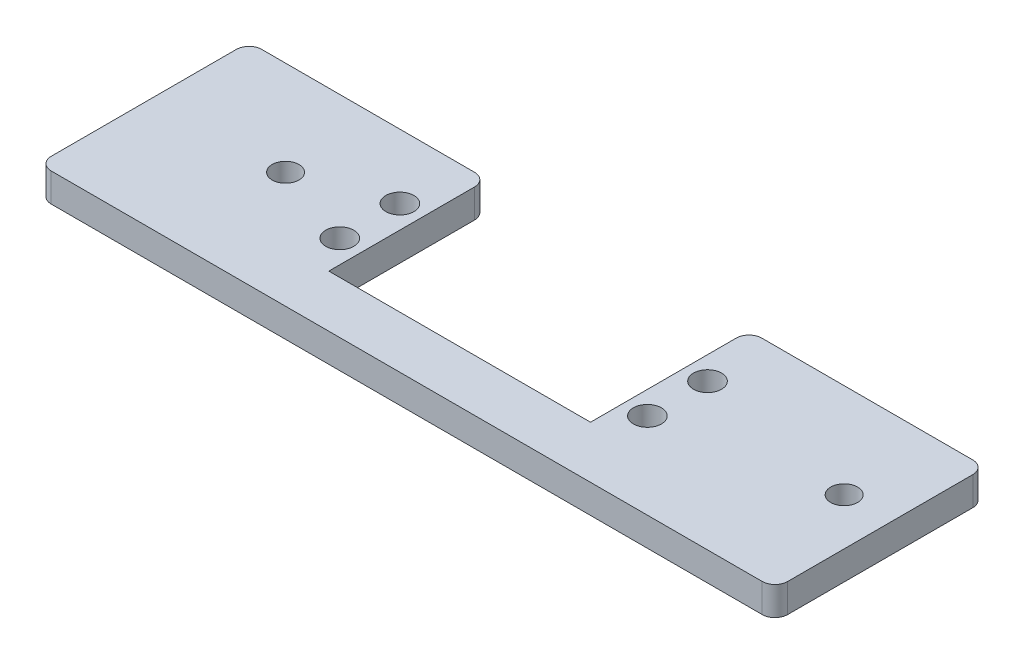
ISO-10303-21;
HEADER;
FILE_DESCRIPTION(('STEP AP214'),'2;1');
FILE_NAME('part.step','',(''),(''),'','','');
FILE_SCHEMA(('AUTOMOTIVE_DESIGN { 1 0 10303 214 1 1 1 1 }'));
ENDSEC;
DATA;
#1=APPLICATION_CONTEXT('core data for automotive mechanical design processes');
#2=APPLICATION_PROTOCOL_DEFINITION('international standard','automotive_design',2000,#1);
#3=PRODUCT_CONTEXT('',#1,'mechanical');
#4=PRODUCT('Part','Part','',(#3));
#5=PRODUCT_RELATED_PRODUCT_CATEGORY('part','',(#4));
#6=PRODUCT_DEFINITION_FORMATION('','',#4);
#7=PRODUCT_DEFINITION_CONTEXT('part definition',#1,'design');
#8=PRODUCT_DEFINITION('design','',#6,#7);
#9=PRODUCT_DEFINITION_SHAPE('','',#8);
#10=(LENGTH_UNIT() NAMED_UNIT(*) SI_UNIT(.MILLI.,.METRE.));
#11=(NAMED_UNIT(*) PLANE_ANGLE_UNIT() SI_UNIT($,.RADIAN.));
#12=(NAMED_UNIT(*) SI_UNIT($,.STERADIAN.) SOLID_ANGLE_UNIT());
#13=UNCERTAINTY_MEASURE_WITH_UNIT(LENGTH_MEASURE(1.E-05),#10,'distance_accuracy_value','');
#14=(GEOMETRIC_REPRESENTATION_CONTEXT(3) GLOBAL_UNCERTAINTY_ASSIGNED_CONTEXT((#13)) GLOBAL_UNIT_ASSIGNED_CONTEXT((#10,
#11,#12)) REPRESENTATION_CONTEXT('',''));
#15=CARTESIAN_POINT('',(0.,0.,0.));
#16=DIRECTION('',(0.,0.,1.));
#17=DIRECTION('',(1.,0.,0.));
#18=AXIS2_PLACEMENT_3D('',#15,#16,#17);
#19=CARTESIAN_POINT('',(22.65807516,4.5,-14.51));
#20=DIRECTION('',(0.,-1.,0.));
#21=DIRECTION('',(0.,0.,-1.));
#22=AXIS2_PLACEMENT_3D('',#19,#20,#21);
#23=PLANE('',#22);
#24=CARTESIAN_POINT('',(24.258075072,4.5,3.025000078));
#25=DIRECTION('',(0.,1.,0.));
#26=DIRECTION('',(0.,0.,1.));
#27=AXIS2_PLACEMENT_3D('',#24,#25,#26);
#28=CIRCLE('',#27,2.2);
#29=CARTESIAN_POINT('',(24.258075072,4.5,5.225000078));
#30=VERTEX_POINT('',#29);
#31=EDGE_CURVE('E326',#30,#30,#28,.T.);
#32=ORIENTED_EDGE('',*,*,#31,.F.);
#33=EDGE_LOOP('',(#32));
#34=FACE_BOUND('',#33,.T.);
#35=CARTESIAN_POINT('',(-23.988324752,4.5,-6.404999922));
#36=DIRECTION('',(0.,1.,0.));
#37=DIRECTION('',(0.,0.,1.));
#38=AXIS2_PLACEMENT_3D('',#35,#36,#37);
#39=CIRCLE('',#38,2.2);
#40=CARTESIAN_POINT('',(-23.988324752,4.5,-4.204999922));
#41=VERTEX_POINT('',#40);
#42=EDGE_CURVE('E338',#41,#41,#39,.T.);
#43=ORIENTED_EDGE('',*,*,#42,.F.);
#44=EDGE_LOOP('',(#43));
#45=FACE_BOUND('',#44,.T.);
#46=CARTESIAN_POINT('',(-37.20312484,4.5,-1.689999922));
#47=DIRECTION('',(0.,1.,0.));
#48=DIRECTION('',(0.,0.,1.));
#49=AXIS2_PLACEMENT_3D('',#46,#47,#48);
#50=CIRCLE('',#49,2.1082);
#51=CARTESIAN_POINT('',(-37.20312484,4.5,0.418200078000001));
#52=VERTEX_POINT('',#51);
#53=EDGE_CURVE('E170',#52,#52,#50,.T.);
#54=ORIENTED_EDGE('',*,*,#53,.F.);
#55=EDGE_LOOP('',(#54));
#56=FACE_BOUND('',#55,.T.);
#57=DIRECTION('',(-1.,0.,0.));
#58=VECTOR('',#57,1.);
#59=CARTESIAN_POINT('',(-20.38832484,4.5,8.345000078));
#60=LINE('',#59,#58);
#61=CARTESIAN_POINT('',(20.65807516,4.5,8.345000078));
#62=VERTEX_POINT('',#61);
#63=CARTESIAN_POINT('',(-20.38832484,4.5,8.345000078));
#64=VERTEX_POINT('',#63);
#65=EDGE_CURVE('E193',#62,#64,#60,.T.);
#66=ORIENTED_EDGE('',*,*,#65,.T.);
#67=DIRECTION('',(0.,0.,-1.));
#68=VECTOR('',#67,1.);
#69=CARTESIAN_POINT('',(-20.38832484,4.5,-14.51));
#70=LINE('',#69,#68);
#71=CARTESIAN_POINT('',(-20.38832484,4.5,-14.51));
#72=VERTEX_POINT('',#71);
#73=EDGE_CURVE('E111',#64,#72,#70,.T.);
#74=ORIENTED_EDGE('',*,*,#73,.T.);
#75=CARTESIAN_POINT('',(-22.38832484,4.5,-14.51));
#76=DIRECTION('',(0.,1.,0.));
#77=DIRECTION('',(0.,0.,1.));
#78=AXIS2_PLACEMENT_3D('',#75,#76,#77);
#79=CIRCLE('',#78,2.);
#80=CARTESIAN_POINT('',(-22.38832484,4.5,-16.51));
#81=VERTEX_POINT('',#80);
#82=EDGE_CURVE('E226',#72,#81,#79,.T.);
#83=ORIENTED_EDGE('',*,*,#82,.T.);
#84=DIRECTION('',(-1.,0.,0.));
#85=VECTOR('',#84,1.);
#86=CARTESIAN_POINT('',(-22.38832484,4.5,-16.51));
#87=LINE('',#86,#85);
#88=CARTESIAN_POINT('',(-55.75,4.5,-16.51));
#89=VERTEX_POINT('',#88);
#90=EDGE_CURVE('E245',#81,#89,#87,.T.);
#91=ORIENTED_EDGE('',*,*,#90,.T.);
#92=CARTESIAN_POINT('',(-55.75,4.5,-14.51));
#93=DIRECTION('',(0.,1.,0.));
#94=DIRECTION('',(0.,0.,1.));
#95=AXIS2_PLACEMENT_3D('',#92,#93,#94);
#96=CIRCLE('',#95,2.);
#97=CARTESIAN_POINT('',(-57.75,4.5,-14.51));
#98=VERTEX_POINT('',#97);
#99=EDGE_CURVE('E242',#89,#98,#96,.T.);
#100=ORIENTED_EDGE('',*,*,#99,.T.);
#101=DIRECTION('',(0.,0.,1.));
#102=VECTOR('',#101,1.);
#103=CARTESIAN_POINT('',(-57.75,4.5,-14.51));
#104=LINE('',#103,#102);
#105=CARTESIAN_POINT('',(-57.75,4.5,14.51));
#106=VERTEX_POINT('',#105);
#107=EDGE_CURVE('E244',#98,#106,#104,.T.);
#108=ORIENTED_EDGE('',*,*,#107,.T.);
#109=CARTESIAN_POINT('',(-55.75,4.5,14.51));
#110=DIRECTION('',(0.,1.,0.));
#111=DIRECTION('',(0.,0.,-1.));
#112=AXIS2_PLACEMENT_3D('',#109,#110,#111);
#113=CIRCLE('',#112,2.);
#114=CARTESIAN_POINT('',(-55.75,4.5,16.51));
#115=VERTEX_POINT('',#114);
#116=EDGE_CURVE('E247',#106,#115,#113,.T.);
#117=ORIENTED_EDGE('',*,*,#116,.T.);
#118=DIRECTION('',(1.,0.,0.));
#119=VECTOR('',#118,1.);
#120=CARTESIAN_POINT('',(55.75,4.5,16.51));
#121=LINE('',#120,#119);
#122=CARTESIAN_POINT('',(55.75,4.5,16.51));
#123=VERTEX_POINT('',#122);
#124=EDGE_CURVE('E253',#115,#123,#121,.T.);
#125=ORIENTED_EDGE('',*,*,#124,.T.);
#126=CARTESIAN_POINT('',(55.75,4.5,14.51));
#127=DIRECTION('',(0.,1.,0.));
#128=DIRECTION('',(0.,0.,-1.));
#129=AXIS2_PLACEMENT_3D('',#126,#127,#128);
#130=CIRCLE('',#129,2.);
#131=CARTESIAN_POINT('',(57.75,4.5,14.51));
#132=VERTEX_POINT('',#131);
#133=EDGE_CURVE('E255',#123,#132,#130,.T.);
#134=ORIENTED_EDGE('',*,*,#133,.T.);
#135=DIRECTION('',(0.,0.,-1.));
#136=VECTOR('',#135,1.);
#137=CARTESIAN_POINT('',(57.75,4.5,-14.51));
#138=LINE('',#137,#136);
#139=CARTESIAN_POINT('',(57.75,4.5,-14.51));
#140=VERTEX_POINT('',#139);
#141=EDGE_CURVE('E257',#132,#140,#138,.T.);
#142=ORIENTED_EDGE('',*,*,#141,.T.);
#143=CARTESIAN_POINT('',(55.75,4.5,-14.51));
#144=DIRECTION('',(0.,1.,0.));
#145=DIRECTION('',(0.,0.,-1.));
#146=AXIS2_PLACEMENT_3D('',#143,#144,#145);
#147=CIRCLE('',#146,2.);
#148=CARTESIAN_POINT('',(55.75,4.5,-16.51));
#149=VERTEX_POINT('',#148);
#150=EDGE_CURVE('E148',#140,#149,#147,.T.);
#151=ORIENTED_EDGE('',*,*,#150,.T.);
#152=DIRECTION('',(-1.,0.,0.));
#153=VECTOR('',#152,1.);
#154=CARTESIAN_POINT('',(55.75,4.5,-16.51));
#155=LINE('',#154,#153);
#156=CARTESIAN_POINT('',(22.65807516,4.5,-16.51));
#157=VERTEX_POINT('',#156);
#158=EDGE_CURVE('E142',#149,#157,#155,.T.);
#159=ORIENTED_EDGE('',*,*,#158,.T.);
#160=CARTESIAN_POINT('',(22.65807516,4.5,-14.51));
#161=DIRECTION('',(0.,1.,0.));
#162=DIRECTION('',(0.,0.,-1.));
#163=AXIS2_PLACEMENT_3D('',#160,#161,#162);
#164=CIRCLE('',#163,2.);
#165=CARTESIAN_POINT('',(20.65807516,4.5,-14.51));
#166=VERTEX_POINT('',#165);
#167=EDGE_CURVE('E146',#157,#166,#164,.T.);
#168=ORIENTED_EDGE('',*,*,#167,.T.);
#169=DIRECTION('',(0.,0.,1.));
#170=VECTOR('',#169,1.);
#171=CARTESIAN_POINT('',(20.65807516,4.5,-14.51));
#172=LINE('',#171,#170);
#173=EDGE_CURVE('E50',#166,#62,#172,.T.);
#174=ORIENTED_EDGE('',*,*,#173,.T.);
#175=EDGE_LOOP('',(#66,#74,#83,#91,#100,#108,#117,#125,#134,#142,#151,#159,#168,#174));
#176=FACE_BOUND('',#175,.T.);
#177=CARTESIAN_POINT('',(50.40147516,4.5,-1.68999992200002));
#178=DIRECTION('',(0.,1.,0.));
#179=DIRECTION('',(0.,0.,-1.));
#180=AXIS2_PLACEMENT_3D('',#177,#178,#179);
#181=CIRCLE('',#180,2.1082);
#182=CARTESIAN_POINT('',(50.40147516,4.5,-3.79819992200002));
#183=VERTEX_POINT('',#182);
#184=EDGE_CURVE('E344',#183,#183,#181,.T.);
#185=ORIENTED_EDGE('',*,*,#184,.F.);
#186=EDGE_LOOP('',(#185));
#187=FACE_BOUND('',#186,.T.);
#188=CARTESIAN_POINT('',(24.258075072,4.5,-6.404999922));
#189=DIRECTION('',(0.,1.,0.));
#190=DIRECTION('',(0.,0.,-1.));
#191=AXIS2_PLACEMENT_3D('',#188,#189,#190);
#192=CIRCLE('',#191,2.2);
#193=CARTESIAN_POINT('',(24.258075072,4.5,-8.604999922));
#194=VERTEX_POINT('',#193);
#195=EDGE_CURVE('E332',#194,#194,#192,.T.);
#196=ORIENTED_EDGE('',*,*,#195,.F.);
#197=EDGE_LOOP('',(#196));
#198=FACE_BOUND('',#197,.T.);
#199=CARTESIAN_POINT('',(-23.988324752,4.5,3.025000078));
#200=DIRECTION('',(0.,1.,0.));
#201=DIRECTION('',(0.,0.,-1.));
#202=AXIS2_PLACEMENT_3D('',#199,#200,#201);
#203=CIRCLE('',#202,2.2);
#204=CARTESIAN_POINT('',(-23.988324752,4.5,0.825000077999996));
#205=VERTEX_POINT('',#204);
#206=EDGE_CURVE('E317',#205,#205,#203,.T.);
#207=ORIENTED_EDGE('',*,*,#206,.F.);
#208=EDGE_LOOP('',(#207));
#209=FACE_BOUND('',#208,.T.);
#210=ADVANCED_FACE('F33',(#34,#45,#56,#176,#187,#198,#209),#23,.F.);
#211=CARTESIAN_POINT('',(22.65807516,0.,-14.51));
#212=DIRECTION('',(0.,-1.,0.));
#213=DIRECTION('',(0.,0.,-1.));
#214=AXIS2_PLACEMENT_3D('',#211,#212,#213);
#215=PLANE('',#214);
#216=CARTESIAN_POINT('',(24.258075072,0.,3.025000078));
#217=DIRECTION('',(0.,1.,0.));
#218=DIRECTION('',(0.,0.,1.));
#219=AXIS2_PLACEMENT_3D('',#216,#217,#218);
#220=CIRCLE('',#219,2.2);
#221=CARTESIAN_POINT('',(24.258075072,0.,5.225000078));
#222=VERTEX_POINT('',#221);
#223=EDGE_CURVE('E323',#222,#222,#220,.T.);
#224=ORIENTED_EDGE('',*,*,#223,.T.);
#225=EDGE_LOOP('',(#224));
#226=FACE_BOUND('',#225,.T.);
#227=CARTESIAN_POINT('',(-23.988324752,0.,-6.404999922));
#228=DIRECTION('',(0.,1.,0.));
#229=DIRECTION('',(0.,0.,1.));
#230=AXIS2_PLACEMENT_3D('',#227,#228,#229);
#231=CIRCLE('',#230,2.2);
#232=CARTESIAN_POINT('',(-23.988324752,0.,-4.204999922));
#233=VERTEX_POINT('',#232);
#234=EDGE_CURVE('E335',#233,#233,#231,.T.);
#235=ORIENTED_EDGE('',*,*,#234,.T.);
#236=EDGE_LOOP('',(#235));
#237=FACE_BOUND('',#236,.T.);
#238=CARTESIAN_POINT('',(-37.20312484,0.,-1.689999922));
#239=DIRECTION('',(0.,1.,0.));
#240=DIRECTION('',(0.,0.,1.));
#241=AXIS2_PLACEMENT_3D('',#238,#239,#240);
#242=CIRCLE('',#241,2.1082);
#243=CARTESIAN_POINT('',(-37.20312484,0.,0.418200078000001));
#244=VERTEX_POINT('',#243);
#245=EDGE_CURVE('E347',#244,#244,#242,.T.);
#246=ORIENTED_EDGE('',*,*,#245,.T.);
#247=EDGE_LOOP('',(#246));
#248=FACE_BOUND('',#247,.T.);
#249=DIRECTION('',(-1.,0.,0.));
#250=VECTOR('',#249,1.);
#251=CARTESIAN_POINT('',(-20.38832484,0.,8.345000078));
#252=LINE('',#251,#250);
#253=CARTESIAN_POINT('',(20.65807516,0.,8.345000078));
#254=VERTEX_POINT('',#253);
#255=CARTESIAN_POINT('',(-20.38832484,0.,8.345000078));
#256=VERTEX_POINT('',#255);
#257=EDGE_CURVE('E166',#254,#256,#252,.T.);
#258=ORIENTED_EDGE('',*,*,#257,.F.);
#259=DIRECTION('',(0.,0.,1.));
#260=VECTOR('',#259,1.);
#261=CARTESIAN_POINT('',(20.65807516,0.,-14.51));
#262=LINE('',#261,#260);
#263=CARTESIAN_POINT('',(20.65807516,0.,-14.51));
#264=VERTEX_POINT('',#263);
#265=EDGE_CURVE('E103',#264,#254,#262,.T.);
#266=ORIENTED_EDGE('',*,*,#265,.F.);
#267=CARTESIAN_POINT('',(22.65807516,0.,-14.51));
#268=DIRECTION('',(0.,1.,0.));
#269=DIRECTION('',(0.,0.,-1.));
#270=AXIS2_PLACEMENT_3D('',#267,#268,#269);
#271=CIRCLE('',#270,2.);
#272=CARTESIAN_POINT('',(22.65807516,0.,-16.51));
#273=VERTEX_POINT('',#272);
#274=EDGE_CURVE('E97',#273,#264,#271,.T.);
#275=ORIENTED_EDGE('',*,*,#274,.F.);
#276=DIRECTION('',(-1.,0.,0.));
#277=VECTOR('',#276,1.);
#278=CARTESIAN_POINT('',(55.75,0.,-16.51));
#279=LINE('',#278,#277);
#280=CARTESIAN_POINT('',(55.75,0.,-16.51));
#281=VERTEX_POINT('',#280);
#282=EDGE_CURVE('E156',#281,#273,#279,.T.);
#283=ORIENTED_EDGE('',*,*,#282,.F.);
#284=CARTESIAN_POINT('',(55.75,0.,-14.51));
#285=DIRECTION('',(0.,1.,0.));
#286=DIRECTION('',(0.,0.,-1.));
#287=AXIS2_PLACEMENT_3D('',#284,#285,#286);
#288=CIRCLE('',#287,2.);
#289=CARTESIAN_POINT('',(57.75,0.,-14.51));
#290=VERTEX_POINT('',#289);
#291=EDGE_CURVE('E188',#290,#281,#288,.T.);
#292=ORIENTED_EDGE('',*,*,#291,.F.);
#293=DIRECTION('',(0.,0.,-1.));
#294=VECTOR('',#293,1.);
#295=CARTESIAN_POINT('',(57.75,0.,-14.51));
#296=LINE('',#295,#294);
#297=CARTESIAN_POINT('',(57.75,0.,14.51));
#298=VERTEX_POINT('',#297);
#299=EDGE_CURVE('E186',#298,#290,#296,.T.);
#300=ORIENTED_EDGE('',*,*,#299,.F.);
#301=CARTESIAN_POINT('',(55.75,0.,14.51));
#302=DIRECTION('',(0.,1.,0.));
#303=DIRECTION('',(0.,0.,-1.));
#304=AXIS2_PLACEMENT_3D('',#301,#302,#303);
#305=CIRCLE('',#304,2.);
#306=CARTESIAN_POINT('',(55.75,0.,16.51));
#307=VERTEX_POINT('',#306);
#308=EDGE_CURVE('E184',#307,#298,#305,.T.);
#309=ORIENTED_EDGE('',*,*,#308,.F.);
#310=DIRECTION('',(1.,0.,0.));
#311=VECTOR('',#310,1.);
#312=CARTESIAN_POINT('',(55.75,0.,16.51));
#313=LINE('',#312,#311);
#314=CARTESIAN_POINT('',(-55.75,0.,16.51));
#315=VERTEX_POINT('',#314);
#316=EDGE_CURVE('E182',#315,#307,#313,.T.);
#317=ORIENTED_EDGE('',*,*,#316,.F.);
#318=CARTESIAN_POINT('',(-55.75,0.,14.51));
#319=DIRECTION('',(0.,1.,0.));
#320=DIRECTION('',(0.,0.,-1.));
#321=AXIS2_PLACEMENT_3D('',#318,#319,#320);
#322=CIRCLE('',#321,2.);
#323=CARTESIAN_POINT('',(-57.75,0.,14.51));
#324=VERTEX_POINT('',#323);
#325=EDGE_CURVE('E180',#324,#315,#322,.T.);
#326=ORIENTED_EDGE('',*,*,#325,.F.);
#327=DIRECTION('',(0.,0.,1.));
#328=VECTOR('',#327,1.);
#329=CARTESIAN_POINT('',(-57.75,0.,-14.51));
#330=LINE('',#329,#328);
#331=CARTESIAN_POINT('',(-57.75,0.,-14.51));
#332=VERTEX_POINT('',#331);
#333=EDGE_CURVE('E178',#332,#324,#330,.T.);
#334=ORIENTED_EDGE('',*,*,#333,.F.);
#335=CARTESIAN_POINT('',(-55.75,0.,-14.51));
#336=DIRECTION('',(0.,1.,0.));
#337=DIRECTION('',(0.,0.,1.));
#338=AXIS2_PLACEMENT_3D('',#335,#336,#337);
#339=CIRCLE('',#338,2.);
#340=CARTESIAN_POINT('',(-55.75,0.,-16.51));
#341=VERTEX_POINT('',#340);
#342=EDGE_CURVE('E176',#341,#332,#339,.T.);
#343=ORIENTED_EDGE('',*,*,#342,.F.);
#344=DIRECTION('',(-1.,0.,0.));
#345=VECTOR('',#344,1.);
#346=CARTESIAN_POINT('',(-22.38832484,0.,-16.51));
#347=LINE('',#346,#345);
#348=CARTESIAN_POINT('',(-22.38832484,0.,-16.51));
#349=VERTEX_POINT('',#348);
#350=EDGE_CURVE('E174',#349,#341,#347,.T.);
#351=ORIENTED_EDGE('',*,*,#350,.F.);
#352=CARTESIAN_POINT('',(-22.38832484,0.,-14.51));
#353=DIRECTION('',(0.,1.,0.));
#354=DIRECTION('',(0.,0.,1.));
#355=AXIS2_PLACEMENT_3D('',#352,#353,#354);
#356=CIRCLE('',#355,2.);
#357=CARTESIAN_POINT('',(-20.38832484,0.,-14.51));
#358=VERTEX_POINT('',#357);
#359=EDGE_CURVE('E172',#358,#349,#356,.T.);
#360=ORIENTED_EDGE('',*,*,#359,.F.);
#361=DIRECTION('',(0.,0.,-1.));
#362=VECTOR('',#361,1.);
#363=CARTESIAN_POINT('',(-20.38832484,0.,-14.51));
#364=LINE('',#363,#362);
#365=EDGE_CURVE('E169',#256,#358,#364,.T.);
#366=ORIENTED_EDGE('',*,*,#365,.F.);
#367=EDGE_LOOP('',(#258,#266,#275,#283,#292,#300,#309,#317,#326,#334,#343,#351,#360,#366));
#368=FACE_BOUND('',#367,.T.);
#369=CARTESIAN_POINT('',(50.40147516,0.,-1.68999992200002));
#370=DIRECTION('',(0.,1.,0.));
#371=DIRECTION('',(0.,0.,-1.));
#372=AXIS2_PLACEMENT_3D('',#369,#370,#371);
#373=CIRCLE('',#372,2.1082);
#374=CARTESIAN_POINT('',(50.40147516,0.,-3.79819992200002));
#375=VERTEX_POINT('',#374);
#376=EDGE_CURVE('E341',#375,#375,#373,.T.);
#377=ORIENTED_EDGE('',*,*,#376,.T.);
#378=EDGE_LOOP('',(#377));
#379=FACE_BOUND('',#378,.T.);
#380=CARTESIAN_POINT('',(24.258075072,0.,-6.404999922));
#381=DIRECTION('',(0.,1.,0.));
#382=DIRECTION('',(0.,0.,-1.));
#383=AXIS2_PLACEMENT_3D('',#380,#381,#382);
#384=CIRCLE('',#383,2.2);
#385=CARTESIAN_POINT('',(24.258075072,0.,-8.604999922));
#386=VERTEX_POINT('',#385);
#387=EDGE_CURVE('E329',#386,#386,#384,.T.);
#388=ORIENTED_EDGE('',*,*,#387,.T.);
#389=EDGE_LOOP('',(#388));
#390=FACE_BOUND('',#389,.T.);
#391=CARTESIAN_POINT('',(-23.988324752,0.,3.025000078));
#392=DIRECTION('',(0.,1.,0.));
#393=DIRECTION('',(0.,0.,-1.));
#394=AXIS2_PLACEMENT_3D('',#391,#392,#393);
#395=CIRCLE('',#394,2.2);
#396=CARTESIAN_POINT('',(-23.988324752,0.,0.825000077999996));
#397=VERTEX_POINT('',#396);
#398=EDGE_CURVE('E320',#397,#397,#395,.T.);
#399=ORIENTED_EDGE('',*,*,#398,.T.);
#400=EDGE_LOOP('',(#399));
#401=FACE_BOUND('',#400,.T.);
#402=ADVANCED_FACE('F230',(#226,#237,#248,#368,#379,#390,#401),#215,.T.);
#403=CARTESIAN_POINT('',(-20.38832484,4.5,8.345000078));
#404=DIRECTION('',(0.,0.,1.));
#405=DIRECTION('',(1.,0.,0.));
#406=AXIS2_PLACEMENT_3D('',#403,#404,#405);
#407=PLANE('',#406);
#408=ORIENTED_EDGE('',*,*,#257,.T.);
#409=DIRECTION('',(0.,-1.,0.));
#410=VECTOR('',#409,1.);
#411=CARTESIAN_POINT('',(-20.38832484,4.5,8.345000078));
#412=LINE('',#411,#410);
#413=EDGE_CURVE('E11',#64,#256,#412,.T.);
#414=ORIENTED_EDGE('',*,*,#413,.F.);
#415=ORIENTED_EDGE('',*,*,#65,.F.);
#416=DIRECTION('',(0.,-1.,0.));
#417=VECTOR('',#416,1.);
#418=CARTESIAN_POINT('',(20.65807516,4.5,8.345000078));
#419=LINE('',#418,#417);
#420=EDGE_CURVE('E162',#62,#254,#419,.T.);
#421=ORIENTED_EDGE('',*,*,#420,.T.);
#422=EDGE_LOOP('',(#408,#414,#415,#421));
#423=FACE_BOUND('',#422,.T.);
#424=ADVANCED_FACE('F35',(#423),#407,.F.);
#425=CARTESIAN_POINT('',(-20.38832484,4.5,-14.51));
#426=DIRECTION('',(-1.,0.,0.));
#427=DIRECTION('',(0.,0.,1.));
#428=AXIS2_PLACEMENT_3D('',#425,#426,#427);
#429=PLANE('',#428);
#430=ORIENTED_EDGE('',*,*,#365,.T.);
#431=DIRECTION('',(0.,-1.,0.));
#432=VECTOR('',#431,1.);
#433=CARTESIAN_POINT('',(-20.38832484,4.5,-14.51));
#434=LINE('',#433,#432);
#435=EDGE_CURVE('E42',#72,#358,#434,.T.);
#436=ORIENTED_EDGE('',*,*,#435,.F.);
#437=ORIENTED_EDGE('',*,*,#73,.F.);
#438=ORIENTED_EDGE('',*,*,#413,.T.);
#439=EDGE_LOOP('',(#430,#436,#437,#438));
#440=FACE_BOUND('',#439,.T.);
#441=ADVANCED_FACE('F494',(#440),#429,.F.);
#442=CARTESIAN_POINT('',(-22.38832484,4.5,-14.51));
#443=DIRECTION('',(0.,-1.,0.));
#444=DIRECTION('',(0.,0.,-1.));
#445=AXIS2_PLACEMENT_3D('',#442,#443,#444);
#446=CYLINDRICAL_SURFACE('',#445,2.);
#447=ORIENTED_EDGE('',*,*,#359,.T.);
#448=DIRECTION('',(0.,-1.,0.));
#449=VECTOR('',#448,1.);
#450=CARTESIAN_POINT('',(-22.38832484,4.5,-16.51));
#451=LINE('',#450,#449);
#452=EDGE_CURVE('E218',#81,#349,#451,.T.);
#453=ORIENTED_EDGE('',*,*,#452,.F.);
#454=ORIENTED_EDGE('',*,*,#82,.F.);
#455=ORIENTED_EDGE('',*,*,#435,.T.);
#456=EDGE_LOOP('',(#447,#453,#454,#455));
#457=FACE_BOUND('',#456,.T.);
#458=ADVANCED_FACE('F224',(#457),#446,.T.);
#459=CARTESIAN_POINT('',(-22.38832484,4.5,-16.51));
#460=DIRECTION('',(0.,0.,1.));
#461=DIRECTION('',(1.,0.,0.));
#462=AXIS2_PLACEMENT_3D('',#459,#460,#461);
#463=PLANE('',#462);
#464=ORIENTED_EDGE('',*,*,#350,.T.);
#465=DIRECTION('',(0.,-1.,0.));
#466=VECTOR('',#465,1.);
#467=CARTESIAN_POINT('',(-55.75,4.5,-16.51));
#468=LINE('',#467,#466);
#469=EDGE_CURVE('E215',#89,#341,#468,.T.);
#470=ORIENTED_EDGE('',*,*,#469,.F.);
#471=ORIENTED_EDGE('',*,*,#90,.F.);
#472=ORIENTED_EDGE('',*,*,#452,.T.);
#473=EDGE_LOOP('',(#464,#470,#471,#472));
#474=FACE_BOUND('',#473,.T.);
#475=ADVANCED_FACE('F236',(#474),#463,.F.);
#476=CARTESIAN_POINT('',(-55.75,4.5,-14.51));
#477=DIRECTION('',(0.,-1.,0.));
#478=DIRECTION('',(0.,0.,-1.));
#479=AXIS2_PLACEMENT_3D('',#476,#477,#478);
#480=CYLINDRICAL_SURFACE('',#479,2.);
#481=ORIENTED_EDGE('',*,*,#342,.T.);
#482=DIRECTION('',(0.,-1.,0.));
#483=VECTOR('',#482,1.);
#484=CARTESIAN_POINT('',(-57.75,4.5,-14.51));
#485=LINE('',#484,#483);
#486=EDGE_CURVE('E212',#98,#332,#485,.T.);
#487=ORIENTED_EDGE('',*,*,#486,.F.);
#488=ORIENTED_EDGE('',*,*,#99,.F.);
#489=ORIENTED_EDGE('',*,*,#469,.T.);
#490=EDGE_LOOP('',(#481,#487,#488,#489));
#491=FACE_BOUND('',#490,.T.);
#492=ADVANCED_FACE('F240',(#491),#480,.T.);
#493=CARTESIAN_POINT('',(-57.75,4.5,-14.51));
#494=DIRECTION('',(1.,0.,0.));
#495=DIRECTION('',(0.,0.,-1.));
#496=AXIS2_PLACEMENT_3D('',#493,#494,#495);
#497=PLANE('',#496);
#498=ORIENTED_EDGE('',*,*,#333,.T.);
#499=DIRECTION('',(0.,-1.,0.));
#500=VECTOR('',#499,1.);
#501=CARTESIAN_POINT('',(-57.75,4.5,14.51));
#502=LINE('',#501,#500);
#503=EDGE_CURVE('E209',#106,#324,#502,.T.);
#504=ORIENTED_EDGE('',*,*,#503,.F.);
#505=ORIENTED_EDGE('',*,*,#107,.F.);
#506=ORIENTED_EDGE('',*,*,#486,.T.);
#507=EDGE_LOOP('',(#498,#504,#505,#506));
#508=FACE_BOUND('',#507,.T.);
#509=ADVANCED_FACE('F459',(#508),#497,.F.);
#510=CARTESIAN_POINT('',(-55.75,4.5,14.51));
#511=DIRECTION('',(0.,-1.,0.));
#512=DIRECTION('',(0.,0.,-1.));
#513=AXIS2_PLACEMENT_3D('',#510,#511,#512);
#514=CYLINDRICAL_SURFACE('',#513,2.);
#515=ORIENTED_EDGE('',*,*,#325,.T.);
#516=DIRECTION('',(0.,-1.,0.));
#517=VECTOR('',#516,1.);
#518=CARTESIAN_POINT('',(-55.75,4.5,16.51));
#519=LINE('',#518,#517);
#520=EDGE_CURVE('E206',#115,#315,#519,.T.);
#521=ORIENTED_EDGE('',*,*,#520,.F.);
#522=ORIENTED_EDGE('',*,*,#116,.F.);
#523=ORIENTED_EDGE('',*,*,#503,.T.);
#524=EDGE_LOOP('',(#515,#521,#522,#523));
#525=FACE_BOUND('',#524,.T.);
#526=ADVANCED_FACE('F449',(#525),#514,.T.);
#527=CARTESIAN_POINT('',(55.75,4.5,16.51));
#528=DIRECTION('',(0.,0.,-1.));
#529=DIRECTION('',(-1.,0.,0.));
#530=AXIS2_PLACEMENT_3D('',#527,#528,#529);
#531=PLANE('',#530);
#532=ORIENTED_EDGE('',*,*,#316,.T.);
#533=DIRECTION('',(0.,-1.,0.));
#534=VECTOR('',#533,1.);
#535=CARTESIAN_POINT('',(55.75,4.5,16.51));
#536=LINE('',#535,#534);
#537=EDGE_CURVE('E203',#123,#307,#536,.T.);
#538=ORIENTED_EDGE('',*,*,#537,.F.);
#539=ORIENTED_EDGE('',*,*,#124,.F.);
#540=ORIENTED_EDGE('',*,*,#520,.T.);
#541=EDGE_LOOP('',(#532,#538,#539,#540));
#542=FACE_BOUND('',#541,.T.);
#543=ADVANCED_FACE('F439',(#542),#531,.F.);
#544=CARTESIAN_POINT('',(55.75,4.5,14.51));
#545=DIRECTION('',(0.,-1.,0.));
#546=DIRECTION('',(0.,0.,-1.));
#547=AXIS2_PLACEMENT_3D('',#544,#545,#546);
#548=CYLINDRICAL_SURFACE('',#547,2.);
#549=ORIENTED_EDGE('',*,*,#308,.T.);
#550=DIRECTION('',(0.,-1.,0.));
#551=VECTOR('',#550,1.);
#552=CARTESIAN_POINT('',(57.75,4.5,14.51));
#553=LINE('',#552,#551);
#554=EDGE_CURVE('E200',#132,#298,#553,.T.);
#555=ORIENTED_EDGE('',*,*,#554,.F.);
#556=ORIENTED_EDGE('',*,*,#133,.F.);
#557=ORIENTED_EDGE('',*,*,#537,.T.);
#558=EDGE_LOOP('',(#549,#555,#556,#557));
#559=FACE_BOUND('',#558,.T.);
#560=ADVANCED_FACE('F430',(#559),#548,.T.);
#561=CARTESIAN_POINT('',(57.75,4.5,-14.51));
#562=DIRECTION('',(-1.,0.,0.));
#563=DIRECTION('',(0.,0.,1.));
#564=AXIS2_PLACEMENT_3D('',#561,#562,#563);
#565=PLANE('',#564);
#566=ORIENTED_EDGE('',*,*,#299,.T.);
#567=DIRECTION('',(0.,-1.,0.));
#568=VECTOR('',#567,1.);
#569=CARTESIAN_POINT('',(57.75,4.5,-14.51));
#570=LINE('',#569,#568);
#571=EDGE_CURVE('E197',#140,#290,#570,.T.);
#572=ORIENTED_EDGE('',*,*,#571,.F.);
#573=ORIENTED_EDGE('',*,*,#141,.F.);
#574=ORIENTED_EDGE('',*,*,#554,.T.);
#575=EDGE_LOOP('',(#566,#572,#573,#574));
#576=FACE_BOUND('',#575,.T.);
#577=ADVANCED_FACE('F263',(#576),#565,.F.);
#578=CARTESIAN_POINT('',(55.75,4.5,-14.51));
#579=DIRECTION('',(0.,-1.,0.));
#580=DIRECTION('',(0.,0.,-1.));
#581=AXIS2_PLACEMENT_3D('',#578,#579,#580);
#582=CYLINDRICAL_SURFACE('',#581,2.);
#583=ORIENTED_EDGE('',*,*,#291,.T.);
#584=DIRECTION('',(0.,-1.,0.));
#585=VECTOR('',#584,1.);
#586=CARTESIAN_POINT('',(55.75,4.5,-16.51));
#587=LINE('',#586,#585);
#588=EDGE_CURVE('E157',#149,#281,#587,.T.);
#589=ORIENTED_EDGE('',*,*,#588,.F.);
#590=ORIENTED_EDGE('',*,*,#150,.F.);
#591=ORIENTED_EDGE('',*,*,#571,.T.);
#592=EDGE_LOOP('',(#583,#589,#590,#591));
#593=FACE_BOUND('',#592,.T.);
#594=ADVANCED_FACE('F267',(#593),#582,.T.);
#595=CARTESIAN_POINT('',(55.75,4.5,-16.51));
#596=DIRECTION('',(0.,0.,1.));
#597=DIRECTION('',(1.,0.,0.));
#598=AXIS2_PLACEMENT_3D('',#595,#596,#597);
#599=PLANE('',#598);
#600=ORIENTED_EDGE('',*,*,#282,.T.);
#601=DIRECTION('',(0.,-1.,0.));
#602=VECTOR('',#601,1.);
#603=CARTESIAN_POINT('',(22.65807516,4.5,-16.51));
#604=LINE('',#603,#602);
#605=EDGE_CURVE('E153',#157,#273,#604,.T.);
#606=ORIENTED_EDGE('',*,*,#605,.F.);
#607=ORIENTED_EDGE('',*,*,#158,.F.);
#608=ORIENTED_EDGE('',*,*,#588,.T.);
#609=EDGE_LOOP('',(#600,#606,#607,#608));
#610=FACE_BOUND('',#609,.T.);
#611=ADVANCED_FACE('F154',(#610),#599,.F.);
#612=CARTESIAN_POINT('',(22.65807516,4.5,-14.51));
#613=DIRECTION('',(0.,-1.,0.));
#614=DIRECTION('',(0.,0.,-1.));
#615=AXIS2_PLACEMENT_3D('',#612,#613,#614);
#616=CYLINDRICAL_SURFACE('',#615,2.);
#617=ORIENTED_EDGE('',*,*,#274,.T.);
#618=DIRECTION('',(0.,-1.,0.));
#619=VECTOR('',#618,1.);
#620=CARTESIAN_POINT('',(20.65807516,4.5,-14.51));
#621=LINE('',#620,#619);
#622=EDGE_CURVE('E158',#166,#264,#621,.T.);
#623=ORIENTED_EDGE('',*,*,#622,.F.);
#624=ORIENTED_EDGE('',*,*,#167,.F.);
#625=ORIENTED_EDGE('',*,*,#605,.T.);
#626=EDGE_LOOP('',(#617,#623,#624,#625));
#627=FACE_BOUND('',#626,.T.);
#628=ADVANCED_FACE('F160',(#627),#616,.T.);
#629=CARTESIAN_POINT('',(20.65807516,4.5,-14.51));
#630=DIRECTION('',(1.,0.,0.));
#631=DIRECTION('',(0.,0.,-1.));
#632=AXIS2_PLACEMENT_3D('',#629,#630,#631);
#633=PLANE('',#632);
#634=ORIENTED_EDGE('',*,*,#265,.T.);
#635=ORIENTED_EDGE('',*,*,#420,.F.);
#636=ORIENTED_EDGE('',*,*,#173,.F.);
#637=ORIENTED_EDGE('',*,*,#622,.T.);
#638=EDGE_LOOP('',(#634,#635,#636,#637));
#639=FACE_BOUND('',#638,.T.);
#640=ADVANCED_FACE('F271',(#639),#633,.F.);
#641=CARTESIAN_POINT('',(-37.20312484,4.5,-1.689999922));
#642=DIRECTION('',(0.,-1.,0.));
#643=DIRECTION('',(0.,0.,-1.));
#644=AXIS2_PLACEMENT_3D('',#641,#642,#643);
#645=CYLINDRICAL_SURFACE('',#644,2.1082);
#646=ORIENTED_EDGE('',*,*,#53,.T.);
#647=EDGE_LOOP('',(#646));
#648=FACE_BOUND('',#647,.T.);
#649=ORIENTED_EDGE('',*,*,#245,.F.);
#650=EDGE_LOOP('',(#649));
#651=FACE_BOUND('',#650,.T.);
#652=ADVANCED_FACE('F273',(#648,#651),#645,.F.);
#653=CARTESIAN_POINT('',(50.40147516,4.5,-1.68999992200002));
#654=DIRECTION('',(0.,-1.,0.));
#655=DIRECTION('',(0.,0.,-1.));
#656=AXIS2_PLACEMENT_3D('',#653,#654,#655);
#657=CYLINDRICAL_SURFACE('',#656,2.1082);
#658=ORIENTED_EDGE('',*,*,#184,.T.);
#659=EDGE_LOOP('',(#658));
#660=FACE_BOUND('',#659,.T.);
#661=ORIENTED_EDGE('',*,*,#376,.F.);
#662=EDGE_LOOP('',(#661));
#663=FACE_BOUND('',#662,.T.);
#664=ADVANCED_FACE('F279',(#660,#663),#657,.F.);
#665=CARTESIAN_POINT('',(-23.988324752,4.5,-6.404999922));
#666=DIRECTION('',(0.,-1.,0.));
#667=DIRECTION('',(0.,0.,-1.));
#668=AXIS2_PLACEMENT_3D('',#665,#666,#667);
#669=CYLINDRICAL_SURFACE('',#668,2.2);
#670=ORIENTED_EDGE('',*,*,#42,.T.);
#671=EDGE_LOOP('',(#670));
#672=FACE_BOUND('',#671,.T.);
#673=ORIENTED_EDGE('',*,*,#234,.F.);
#674=EDGE_LOOP('',(#673));
#675=FACE_BOUND('',#674,.T.);
#676=ADVANCED_FACE('F296',(#672,#675),#669,.F.);
#677=CARTESIAN_POINT('',(24.258075072,4.5,-6.404999922));
#678=DIRECTION('',(0.,-1.,0.));
#679=DIRECTION('',(0.,0.,-1.));
#680=AXIS2_PLACEMENT_3D('',#677,#678,#679);
#681=CYLINDRICAL_SURFACE('',#680,2.2);
#682=ORIENTED_EDGE('',*,*,#195,.T.);
#683=EDGE_LOOP('',(#682));
#684=FACE_BOUND('',#683,.T.);
#685=ORIENTED_EDGE('',*,*,#387,.F.);
#686=EDGE_LOOP('',(#685));
#687=FACE_BOUND('',#686,.T.);
#688=ADVANCED_FACE('F300',(#684,#687),#681,.F.);
#689=CARTESIAN_POINT('',(24.258075072,4.5,3.025000078));
#690=DIRECTION('',(0.,-1.,0.));
#691=DIRECTION('',(0.,0.,-1.));
#692=AXIS2_PLACEMENT_3D('',#689,#690,#691);
#693=CYLINDRICAL_SURFACE('',#692,2.2);
#694=ORIENTED_EDGE('',*,*,#31,.T.);
#695=EDGE_LOOP('',(#694));
#696=FACE_BOUND('',#695,.T.);
#697=ORIENTED_EDGE('',*,*,#223,.F.);
#698=EDGE_LOOP('',(#697));
#699=FACE_BOUND('',#698,.T.);
#700=ADVANCED_FACE('F304',(#696,#699),#693,.F.);
#701=CARTESIAN_POINT('',(-23.988324752,4.5,3.025000078));
#702=DIRECTION('',(0.,-1.,0.));
#703=DIRECTION('',(0.,0.,-1.));
#704=AXIS2_PLACEMENT_3D('',#701,#702,#703);
#705=CYLINDRICAL_SURFACE('',#704,2.2);
#706=ORIENTED_EDGE('',*,*,#206,.T.);
#707=EDGE_LOOP('',(#706));
#708=FACE_BOUND('',#707,.T.);
#709=ORIENTED_EDGE('',*,*,#398,.F.);
#710=EDGE_LOOP('',(#709));
#711=FACE_BOUND('',#710,.T.);
#712=ADVANCED_FACE('F308',(#708,#711),#705,.F.);
#713=CLOSED_SHELL('',(#210,#402,#424,#441,#458,#475,#492,#509,#526,#543,#560,#577,#594,#611,
#628,#640,#652,#664,#676,#688,#700,#712));
#714=MANIFOLD_SOLID_BREP('B2',#713);
#715=ADVANCED_BREP_SHAPE_REPRESENTATION('',(#18,#714),#14);
#716=SHAPE_DEFINITION_REPRESENTATION(#9,#715);
ENDSEC;
END-ISO-10303-21;
